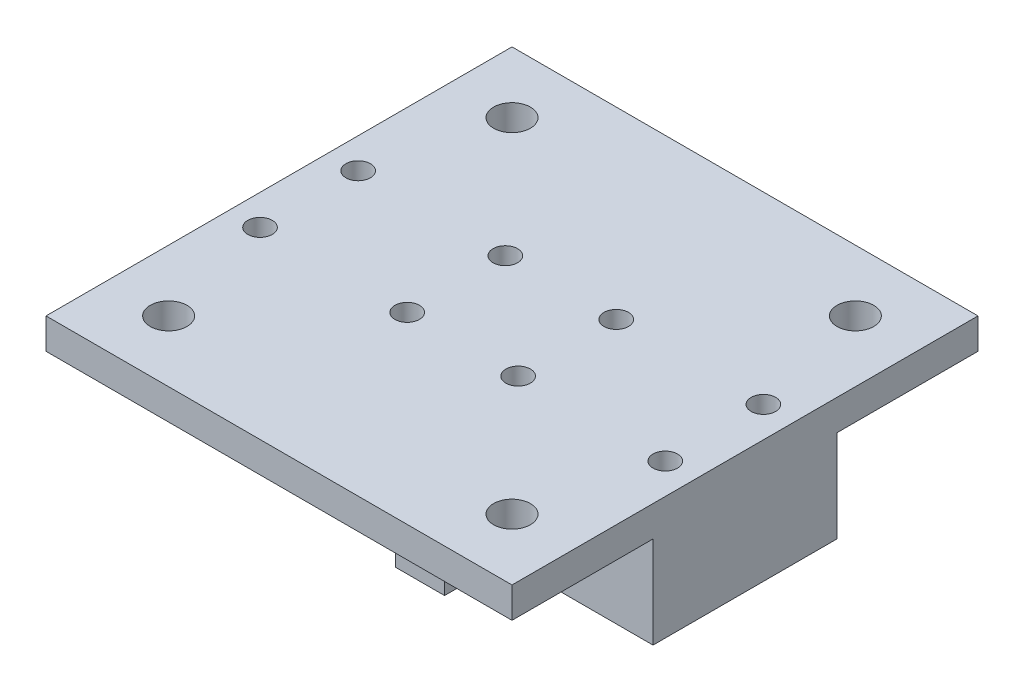
ISO-10303-21;
HEADER;
FILE_DESCRIPTION(('STEP AP214'),'2;1');
FILE_NAME('part.step','',(''),(''),'','','');
FILE_SCHEMA(('AUTOMOTIVE_DESIGN { 1 0 10303 214 1 1 1 1 }'));
ENDSEC;
DATA;
#1=APPLICATION_CONTEXT('core data for automotive mechanical design processes');
#2=APPLICATION_PROTOCOL_DEFINITION('international standard','automotive_design',2000,#1);
#3=PRODUCT_CONTEXT('',#1,'mechanical');
#4=PRODUCT('Part','Part','',(#3));
#5=PRODUCT_RELATED_PRODUCT_CATEGORY('part','',(#4));
#6=PRODUCT_DEFINITION_FORMATION('','',#4);
#7=PRODUCT_DEFINITION_CONTEXT('part definition',#1,'design');
#8=PRODUCT_DEFINITION('design','',#6,#7);
#9=PRODUCT_DEFINITION_SHAPE('','',#8);
#10=(LENGTH_UNIT() NAMED_UNIT(*) SI_UNIT(.MILLI.,.METRE.));
#11=(NAMED_UNIT(*) PLANE_ANGLE_UNIT() SI_UNIT($,.RADIAN.));
#12=(NAMED_UNIT(*) SI_UNIT($,.STERADIAN.) SOLID_ANGLE_UNIT());
#13=UNCERTAINTY_MEASURE_WITH_UNIT(LENGTH_MEASURE(1.E-05),#10,'distance_accuracy_value','');
#14=(GEOMETRIC_REPRESENTATION_CONTEXT(3) GLOBAL_UNCERTAINTY_ASSIGNED_CONTEXT((#13)) GLOBAL_UNIT_ASSIGNED_CONTEXT((#10,
#11,#12)) REPRESENTATION_CONTEXT('',''));
#15=CARTESIAN_POINT('',(0.,0.,0.));
#16=DIRECTION('',(0.,0.,1.));
#17=DIRECTION('',(1.,0.,0.));
#18=AXIS2_PLACEMENT_3D('',#15,#16,#17);
#19=CARTESIAN_POINT('',(4.,-15.,-30.));
#20=DIRECTION('',(0.,-1.,0.));
#21=DIRECTION('',(0.,0.,-1.));
#22=AXIS2_PLACEMENT_3D('',#19,#20,#21);
#23=PLANE('',#22);
#24=DIRECTION('',(1.,0.,0.));
#25=VECTOR('',#24,1.);
#26=CARTESIAN_POINT('',(4.,-15.,-25.));
#27=LINE('',#26,#25);
#28=CARTESIAN_POINT('',(-4.,-15.,-25.));
#29=VERTEX_POINT('',#28);
#30=CARTESIAN_POINT('',(4.,-15.,-25.));
#31=VERTEX_POINT('',#30);
#32=EDGE_CURVE('E198',#29,#31,#27,.T.);
#33=ORIENTED_EDGE('',*,*,#32,.F.);
#34=DIRECTION('',(0.,0.,1.));
#35=VECTOR('',#34,1.);
#36=CARTESIAN_POINT('',(-4.,-15.,-30.));
#37=LINE('',#36,#35);
#38=CARTESIAN_POINT('',(-4.,-15.,-30.));
#39=VERTEX_POINT('',#38);
#40=EDGE_CURVE('E329',#39,#29,#37,.T.);
#41=ORIENTED_EDGE('',*,*,#40,.F.);
#42=DIRECTION('',(1.,0.,0.));
#43=VECTOR('',#42,1.);
#44=CARTESIAN_POINT('',(-4.,-15.,-30.));
#45=LINE('',#44,#43);
#46=CARTESIAN_POINT('',(4.,-15.,-30.));
#47=VERTEX_POINT('',#46);
#48=EDGE_CURVE('E292',#39,#47,#45,.T.);
#49=ORIENTED_EDGE('',*,*,#48,.T.);
#50=DIRECTION('',(0.,0.,1.));
#51=VECTOR('',#50,1.);
#52=CARTESIAN_POINT('',(4.,-15.,-30.));
#53=LINE('',#52,#51);
#54=EDGE_CURVE('E347',#47,#31,#53,.T.);
#55=ORIENTED_EDGE('',*,*,#54,.T.);
#56=EDGE_LOOP('',(#33,#41,#49,#55));
#57=FACE_BOUND('',#56,.T.);
#58=ADVANCED_FACE('F36',(#57),#23,.T.);
#59=CARTESIAN_POINT('',(0.,-10.,-30.));
#60=DIRECTION('',(0.,-1.,0.));
#61=DIRECTION('',(0.,0.,-1.));
#62=AXIS2_PLACEMENT_3D('',#59,#60,#61);
#63=PLANE('',#62);
#64=DIRECTION('',(0.,0.,1.));
#65=VECTOR('',#64,1.);
#66=CARTESIAN_POINT('',(-2.5,-10.,-30.));
#67=LINE('',#66,#65);
#68=CARTESIAN_POINT('',(-2.5,-10.,-30.));
#69=VERTEX_POINT('',#68);
#70=CARTESIAN_POINT('',(-2.5,-10.,-25.));
#71=VERTEX_POINT('',#70);
#72=EDGE_CURVE('E278',#69,#71,#67,.T.);
#73=ORIENTED_EDGE('',*,*,#72,.T.);
#74=DIRECTION('',(1.,0.,0.));
#75=VECTOR('',#74,1.);
#76=CARTESIAN_POINT('',(0.,-10.,-25.));
#77=LINE('',#76,#75);
#78=CARTESIAN_POINT('',(2.5,-10.,-25.));
#79=VERTEX_POINT('',#78);
#80=EDGE_CURVE('E11',#71,#79,#77,.T.);
#81=ORIENTED_EDGE('',*,*,#80,.T.);
#82=DIRECTION('',(0.,0.,1.));
#83=VECTOR('',#82,1.);
#84=CARTESIAN_POINT('',(2.5,-10.,-30.));
#85=LINE('',#84,#83);
#86=CARTESIAN_POINT('',(2.5,-10.,-30.));
#87=VERTEX_POINT('',#86);
#88=EDGE_CURVE('E288',#87,#79,#85,.T.);
#89=ORIENTED_EDGE('',*,*,#88,.F.);
#90=DIRECTION('',(1.,0.,0.));
#91=VECTOR('',#90,1.);
#92=CARTESIAN_POINT('',(0.,-10.,-30.));
#93=LINE('',#92,#91);
#94=EDGE_CURVE('E254',#69,#87,#93,.T.);
#95=ORIENTED_EDGE('',*,*,#94,.F.);
#96=EDGE_LOOP('',(#73,#81,#89,#95));
#97=FACE_BOUND('',#96,.T.);
#98=ADVANCED_FACE('F535',(#97),#63,.F.);
#99=CARTESIAN_POINT('',(0.,0.,0.));
#100=DIRECTION('',(0.,0.,-1.));
#101=DIRECTION('',(-1.,0.,0.));
#102=AXIS2_PLACEMENT_3D('',#99,#100,#101);
#103=PLANE('',#102);
#104=DIRECTION('',(1.,0.,0.));
#105=VECTOR('',#104,1.);
#106=CARTESIAN_POINT('',(0.,-10.,0.));
#107=LINE('',#106,#105);
#108=CARTESIAN_POINT('',(-2.5,-10.,0.));
#109=VERTEX_POINT('',#108);
#110=CARTESIAN_POINT('',(2.5,-10.,0.));
#111=VERTEX_POINT('',#110);
#112=EDGE_CURVE('E253',#109,#111,#107,.T.);
#113=ORIENTED_EDGE('',*,*,#112,.F.);
#114=DIRECTION('',(0.,-1.,0.));
#115=VECTOR('',#114,1.);
#116=CARTESIAN_POINT('',(-2.5,-7.50000000000001,0.));
#117=LINE('',#116,#115);
#118=CARTESIAN_POINT('',(-2.5,-5.,0.));
#119=VERTEX_POINT('',#118);
#120=EDGE_CURVE('E258',#119,#109,#117,.T.);
#121=ORIENTED_EDGE('',*,*,#120,.F.);
#122=DIRECTION('',(-1.,0.,0.));
#123=VECTOR('',#122,1.);
#124=CARTESIAN_POINT('',(-2.5,-5.,0.));
#125=LINE('',#124,#123);
#126=CARTESIAN_POINT('',(2.5,-5.,0.));
#127=VERTEX_POINT('',#126);
#128=EDGE_CURVE('E273',#127,#119,#125,.T.);
#129=ORIENTED_EDGE('',*,*,#128,.F.);
#130=DIRECTION('',(0.,1.,0.));
#131=VECTOR('',#130,1.);
#132=CARTESIAN_POINT('',(2.5,-7.50000000000001,0.));
#133=LINE('',#132,#131);
#134=EDGE_CURVE('E270',#111,#127,#133,.T.);
#135=ORIENTED_EDGE('',*,*,#134,.F.);
#136=EDGE_LOOP('',(#113,#121,#129,#135));
#137=FACE_BOUND('',#136,.T.);
#138=DIRECTION('',(1.,0.,0.));
#139=VECTOR('',#138,1.);
#140=CARTESIAN_POINT('',(-38.,10.,0.));
#141=LINE('',#140,#139);
#142=CARTESIAN_POINT('',(-38.,10.,0.));
#143=VERTEX_POINT('',#142);
#144=CARTESIAN_POINT('',(38.,10.,0.));
#145=VERTEX_POINT('',#144);
#146=EDGE_CURVE('E234',#143,#145,#141,.T.);
#147=ORIENTED_EDGE('',*,*,#146,.F.);
#148=DIRECTION('',(0.,-1.,0.));
#149=VECTOR('',#148,1.);
#150=CARTESIAN_POINT('',(-38.,9.99999999999999,0.));
#151=LINE('',#150,#149);
#152=CARTESIAN_POINT('',(-38.,-5.,0.));
#153=VERTEX_POINT('',#152);
#154=EDGE_CURVE('E322',#143,#153,#151,.T.);
#155=ORIENTED_EDGE('',*,*,#154,.T.);
#156=DIRECTION('',(1.,0.,0.));
#157=VECTOR('',#156,1.);
#158=CARTESIAN_POINT('',(-38.,-5.,0.));
#159=LINE('',#158,#157);
#160=CARTESIAN_POINT('',(-4.,-5.,0.));
#161=VERTEX_POINT('',#160);
#162=EDGE_CURVE('E324',#153,#161,#159,.T.);
#163=ORIENTED_EDGE('',*,*,#162,.T.);
#164=DIRECTION('',(0.,-1.,0.));
#165=VECTOR('',#164,1.);
#166=CARTESIAN_POINT('',(-4.,-5.,0.));
#167=LINE('',#166,#165);
#168=CARTESIAN_POINT('',(-4.,-15.,0.));
#169=VERTEX_POINT('',#168);
#170=EDGE_CURVE('E295',#161,#169,#167,.T.);
#171=ORIENTED_EDGE('',*,*,#170,.T.);
#172=DIRECTION('',(1.,0.,0.));
#173=VECTOR('',#172,1.);
#174=CARTESIAN_POINT('',(4.,-15.,0.));
#175=LINE('',#174,#173);
#176=CARTESIAN_POINT('',(4.,-15.,0.));
#177=VERTEX_POINT('',#176);
#178=EDGE_CURVE('E281',#169,#177,#175,.T.);
#179=ORIENTED_EDGE('',*,*,#178,.T.);
#180=DIRECTION('',(0.,1.,0.));
#181=VECTOR('',#180,1.);
#182=CARTESIAN_POINT('',(4.,-5.,0.));
#183=LINE('',#182,#181);
#184=CARTESIAN_POINT('',(4.,-5.,0.));
#185=VERTEX_POINT('',#184);
#186=EDGE_CURVE('E314',#177,#185,#183,.T.);
#187=ORIENTED_EDGE('',*,*,#186,.T.);
#188=DIRECTION('',(1.,0.,0.));
#189=VECTOR('',#188,1.);
#190=CARTESIAN_POINT('',(4.,-5.,0.));
#191=LINE('',#190,#189);
#192=CARTESIAN_POINT('',(38.,-5.,0.));
#193=VERTEX_POINT('',#192);
#194=EDGE_CURVE('E317',#185,#193,#191,.T.);
#195=ORIENTED_EDGE('',*,*,#194,.T.);
#196=DIRECTION('',(0.,1.,0.));
#197=VECTOR('',#196,1.);
#198=CARTESIAN_POINT('',(38.,9.99999999999999,0.));
#199=LINE('',#198,#197);
#200=EDGE_CURVE('E320',#193,#145,#199,.T.);
#201=ORIENTED_EDGE('',*,*,#200,.T.);
#202=EDGE_LOOP('',(#147,#155,#163,#171,#179,#187,#195,#201));
#203=FACE_BOUND('',#202,.T.);
#204=ADVANCED_FACE('F514',(#137,#203),#103,.F.);
#205=CARTESIAN_POINT('',(-4.,-5.,-30.));
#206=DIRECTION('',(-1.,0.,0.));
#207=DIRECTION('',(0.,0.,1.));
#208=AXIS2_PLACEMENT_3D('',#205,#206,#207);
#209=PLANE('',#208);
#210=DIRECTION('',(0.,-1.,0.));
#211=VECTOR('',#210,1.);
#212=CARTESIAN_POINT('',(-4.,-10.,-25.));
#213=LINE('',#212,#211);
#214=CARTESIAN_POINT('',(-4.,-10.,-25.));
#215=VERTEX_POINT('',#214);
#216=EDGE_CURVE('E208',#215,#29,#213,.T.);
#217=ORIENTED_EDGE('',*,*,#216,.F.);
#218=DIRECTION('',(0.,0.,-1.));
#219=VECTOR('',#218,1.);
#220=CARTESIAN_POINT('',(-4.,-10.,-5.));
#221=LINE('',#220,#219);
#222=CARTESIAN_POINT('',(-4.,-10.,-5.));
#223=VERTEX_POINT('',#222);
#224=EDGE_CURVE('E188',#223,#215,#221,.T.);
#225=ORIENTED_EDGE('',*,*,#224,.F.);
#226=DIRECTION('',(0.,-1.,0.));
#227=VECTOR('',#226,1.);
#228=CARTESIAN_POINT('',(-4.,-10.,-5.));
#229=LINE('',#228,#227);
#230=CARTESIAN_POINT('',(-4.,-15.,-5.));
#231=VERTEX_POINT('',#230);
#232=EDGE_CURVE('E204',#223,#231,#229,.T.);
#233=ORIENTED_EDGE('',*,*,#232,.T.);
#234=EDGE_CURVE('E332',#231,#169,#37,.T.);
#235=ORIENTED_EDGE('',*,*,#234,.T.);
#236=ORIENTED_EDGE('',*,*,#170,.F.);
#237=DIRECTION('',(0.,0.,1.));
#238=VECTOR('',#237,1.);
#239=CARTESIAN_POINT('',(-4.,-5.,-30.));
#240=LINE('',#239,#238);
#241=CARTESIAN_POINT('',(-4.,-5.,-30.));
#242=VERTEX_POINT('',#241);
#243=EDGE_CURVE('E333',#242,#161,#240,.T.);
#244=ORIENTED_EDGE('',*,*,#243,.F.);
#245=DIRECTION('',(0.,-1.,0.));
#246=VECTOR('',#245,1.);
#247=CARTESIAN_POINT('',(-4.,-5.,-30.));
#248=LINE('',#247,#246);
#249=EDGE_CURVE('E309',#242,#39,#248,.T.);
#250=ORIENTED_EDGE('',*,*,#249,.T.);
#251=ORIENTED_EDGE('',*,*,#40,.T.);
#252=EDGE_LOOP('',(#217,#225,#233,#235,#236,#244,#250,#251));
#253=FACE_BOUND('',#252,.T.);
#254=ADVANCED_FACE('F367',(#253),#209,.T.);
#255=CARTESIAN_POINT('',(-38.,-5.,-30.));
#256=DIRECTION('',(0.,-1.,0.));
#257=DIRECTION('',(0.,0.,-1.));
#258=AXIS2_PLACEMENT_3D('',#255,#256,#257);
#259=PLANE('',#258);
#260=CARTESIAN_POINT('',(-9.04824963488739,-5.,-22.9546021896256));
#261=DIRECTION('',(0.,-1.,0.));
#262=DIRECTION('',(0.,0.,-1.));
#263=AXIS2_PLACEMENT_3D('',#260,#261,#262);
#264=CIRCLE('',#263,2.);
#265=CARTESIAN_POINT('',(-9.04824963488739,-5.,-24.9546021896256));
#266=VERTEX_POINT('',#265);
#267=EDGE_CURVE('E400',#266,#266,#264,.T.);
#268=ORIENTED_EDGE('',*,*,#267,.F.);
#269=EDGE_LOOP('',(#268));
#270=FACE_BOUND('',#269,.T.);
#271=CARTESIAN_POINT('',(-33.0482496348874,-5.,-22.9546021896256));
#272=DIRECTION('',(0.,-1.,0.));
#273=DIRECTION('',(0.,0.,-1.));
#274=AXIS2_PLACEMENT_3D('',#271,#272,#273);
#275=CIRCLE('',#274,2.);
#276=CARTESIAN_POINT('',(-33.0482496348874,-5.,-24.9546021896256));
#277=VERTEX_POINT('',#276);
#278=EDGE_CURVE('E381',#277,#277,#275,.T.);
#279=ORIENTED_EDGE('',*,*,#278,.F.);
#280=EDGE_LOOP('',(#279));
#281=FACE_BOUND('',#280,.T.);
#282=CARTESIAN_POINT('',(-9.04824963488739,-5.,-6.95460218962563));
#283=DIRECTION('',(0.,-1.,0.));
#284=DIRECTION('',(0.,0.,-1.));
#285=AXIS2_PLACEMENT_3D('',#282,#283,#284);
#286=CIRCLE('',#285,2.);
#287=CARTESIAN_POINT('',(-9.04824963488739,-5.,-8.95460218962563));
#288=VERTEX_POINT('',#287);
#289=EDGE_CURVE('E388',#288,#288,#286,.T.);
#290=ORIENTED_EDGE('',*,*,#289,.F.);
#291=EDGE_LOOP('',(#290));
#292=FACE_BOUND('',#291,.T.);
#293=CARTESIAN_POINT('',(-33.0482496348874,-5.,-6.95460218962563));
#294=DIRECTION('',(0.,-1.,0.));
#295=DIRECTION('',(0.,0.,-1.));
#296=AXIS2_PLACEMENT_3D('',#293,#294,#295);
#297=CIRCLE('',#296,2.);
#298=CARTESIAN_POINT('',(-33.0482496348874,-5.,-8.95460218962563));
#299=VERTEX_POINT('',#298);
#300=EDGE_CURVE('E375',#299,#299,#297,.T.);
#301=ORIENTED_EDGE('',*,*,#300,.F.);
#302=EDGE_LOOP('',(#301));
#303=FACE_BOUND('',#302,.T.);
#304=ORIENTED_EDGE('',*,*,#162,.F.);
#305=DIRECTION('',(0.,0.,1.));
#306=VECTOR('',#305,1.);
#307=CARTESIAN_POINT('',(-38.,-5.,-30.));
#308=LINE('',#307,#306);
#309=CARTESIAN_POINT('',(-38.,-5.,-30.));
#310=VERTEX_POINT('',#309);
#311=EDGE_CURVE('E335',#310,#153,#308,.T.);
#312=ORIENTED_EDGE('',*,*,#311,.F.);
#313=DIRECTION('',(1.,0.,0.));
#314=VECTOR('',#313,1.);
#315=CARTESIAN_POINT('',(-38.,-5.,-30.));
#316=LINE('',#315,#314);
#317=EDGE_CURVE('E306',#310,#242,#316,.T.);
#318=ORIENTED_EDGE('',*,*,#317,.T.);
#319=ORIENTED_EDGE('',*,*,#243,.T.);
#320=EDGE_LOOP('',(#304,#312,#318,#319));
#321=FACE_BOUND('',#320,.T.);
#322=ADVANCED_FACE('F524',(#270,#281,#292,#303,#321),#259,.T.);
#323=CARTESIAN_POINT('',(-38.,9.99999999999999,-30.));
#324=DIRECTION('',(-1.,0.,0.));
#325=DIRECTION('',(0.,0.,1.));
#326=AXIS2_PLACEMENT_3D('',#323,#324,#325);
#327=PLANE('',#326);
#328=ORIENTED_EDGE('',*,*,#154,.F.);
#329=DIRECTION('',(0.,0.,-1.));
#330=VECTOR('',#329,1.);
#331=CARTESIAN_POINT('',(-38.,10.,23.));
#332=LINE('',#331,#330);
#333=CARTESIAN_POINT('',(-38.,10.,23.));
#334=VERTEX_POINT('',#333);
#335=EDGE_CURVE('E250',#334,#143,#332,.T.);
#336=ORIENTED_EDGE('',*,*,#335,.F.);
#337=DIRECTION('',(0.,-1.,0.));
#338=VECTOR('',#337,1.);
#339=CARTESIAN_POINT('',(-38.,15.,23.));
#340=LINE('',#339,#338);
#341=CARTESIAN_POINT('',(-38.,15.,23.));
#342=VERTEX_POINT('',#341);
#343=EDGE_CURVE('E238',#342,#334,#340,.T.);
#344=ORIENTED_EDGE('',*,*,#343,.F.);
#345=DIRECTION('',(0.,0.,1.));
#346=VECTOR('',#345,1.);
#347=CARTESIAN_POINT('',(-38.,15.,-30.));
#348=LINE('',#347,#346);
#349=CARTESIAN_POINT('',(-38.,15.,-53.));
#350=VERTEX_POINT('',#349);
#351=EDGE_CURVE('E338',#350,#342,#348,.T.);
#352=ORIENTED_EDGE('',*,*,#351,.F.);
#353=DIRECTION('',(0.,1.,0.));
#354=VECTOR('',#353,1.);
#355=CARTESIAN_POINT('',(-38.,10.,-53.));
#356=LINE('',#355,#354);
#357=CARTESIAN_POINT('',(-38.,10.,-53.));
#358=VERTEX_POINT('',#357);
#359=EDGE_CURVE('E222',#358,#350,#356,.T.);
#360=ORIENTED_EDGE('',*,*,#359,.F.);
#361=DIRECTION('',(0.,0.,1.));
#362=VECTOR('',#361,1.);
#363=CARTESIAN_POINT('',(-38.,10.,-53.));
#364=LINE('',#363,#362);
#365=CARTESIAN_POINT('',(-38.,10.,-30.));
#366=VERTEX_POINT('',#365);
#367=EDGE_CURVE('E225',#358,#366,#364,.T.);
#368=ORIENTED_EDGE('',*,*,#367,.T.);
#369=DIRECTION('',(0.,-1.,0.));
#370=VECTOR('',#369,1.);
#371=CARTESIAN_POINT('',(-38.,15.,-30.));
#372=LINE('',#371,#370);
#373=EDGE_CURVE('E304',#366,#310,#372,.T.);
#374=ORIENTED_EDGE('',*,*,#373,.T.);
#375=ORIENTED_EDGE('',*,*,#311,.T.);
#376=EDGE_LOOP('',(#328,#336,#344,#352,#360,#368,#374,#375));
#377=FACE_BOUND('',#376,.T.);
#378=ADVANCED_FACE('F461',(#377),#327,.T.);
#379=CARTESIAN_POINT('',(0.,15.,-30.));
#380=DIRECTION('',(0.,1.,0.));
#381=DIRECTION('',(0.,0.,1.));
#382=AXIS2_PLACEMENT_3D('',#379,#380,#381);
#383=PLANE('',#382);
#384=CARTESIAN_POINT('',(28.,15.,-42.9999999999998));
#385=DIRECTION('',(0.,1.,0.));
#386=DIRECTION('',(0.,0.,1.));
#387=AXIS2_PLACEMENT_3D('',#384,#385,#386);
#388=CIRCLE('',#387,3.);
#389=CARTESIAN_POINT('',(28.,15.,-39.9999999999998));
#390=VERTEX_POINT('',#389);
#391=EDGE_CURVE('E429',#390,#390,#388,.T.);
#392=ORIENTED_EDGE('',*,*,#391,.F.);
#393=EDGE_LOOP('',(#392));
#394=FACE_BOUND('',#393,.T.);
#395=CARTESIAN_POINT('',(-28.,15.,-43.));
#396=DIRECTION('',(0.,1.,0.));
#397=DIRECTION('',(0.,0.,1.));
#398=AXIS2_PLACEMENT_3D('',#395,#396,#397);
#399=CIRCLE('',#398,3.);
#400=CARTESIAN_POINT('',(-28.,15.,-40.));
#401=VERTEX_POINT('',#400);
#402=EDGE_CURVE('E435',#401,#401,#399,.T.);
#403=ORIENTED_EDGE('',*,*,#402,.F.);
#404=EDGE_LOOP('',(#403));
#405=FACE_BOUND('',#404,.T.);
#406=CARTESIAN_POINT('',(-28.,15.,13.));
#407=DIRECTION('',(0.,1.,0.));
#408=DIRECTION('',(0.,0.,1.));
#409=AXIS2_PLACEMENT_3D('',#406,#407,#408);
#410=CIRCLE('',#409,3.);
#411=CARTESIAN_POINT('',(-28.,15.,16.));
#412=VERTEX_POINT('',#411);
#413=EDGE_CURVE('E441',#412,#412,#410,.T.);
#414=ORIENTED_EDGE('',*,*,#413,.F.);
#415=EDGE_LOOP('',(#414));
#416=FACE_BOUND('',#415,.T.);
#417=CARTESIAN_POINT('',(28.,15.,13.0000000000001));
#418=DIRECTION('',(0.,1.,0.));
#419=DIRECTION('',(0.,0.,1.));
#420=AXIS2_PLACEMENT_3D('',#417,#418,#419);
#421=CIRCLE('',#420,3.);
#422=CARTESIAN_POINT('',(28.,15.,16.0000000000001));
#423=VERTEX_POINT('',#422);
#424=EDGE_CURVE('E423',#423,#423,#421,.T.);
#425=ORIENTED_EDGE('',*,*,#424,.F.);
#426=EDGE_LOOP('',(#425));
#427=FACE_BOUND('',#426,.T.);
#428=CARTESIAN_POINT('',(9.,15.,-7.));
#429=DIRECTION('',(0.,-1.,0.));
#430=DIRECTION('',(0.,0.,-1.));
#431=AXIS2_PLACEMENT_3D('',#428,#429,#430);
#432=CIRCLE('',#431,2.);
#433=CARTESIAN_POINT('',(9.,15.,-9.));
#434=VERTEX_POINT('',#433);
#435=EDGE_CURVE('E396',#434,#434,#432,.T.);
#436=ORIENTED_EDGE('',*,*,#435,.T.);
#437=EDGE_LOOP('',(#436));
#438=FACE_BOUND('',#437,.T.);
#439=CARTESIAN_POINT('',(-9.04824963488739,15.,-22.9546021896256));
#440=DIRECTION('',(0.,-1.,0.));
#441=DIRECTION('',(0.,0.,-1.));
#442=AXIS2_PLACEMENT_3D('',#439,#440,#441);
#443=CIRCLE('',#442,2.);
#444=CARTESIAN_POINT('',(-9.04824963488739,15.,-24.9546021896256));
#445=VERTEX_POINT('',#444);
#446=EDGE_CURVE('E385',#445,#445,#443,.T.);
#447=ORIENTED_EDGE('',*,*,#446,.T.);
#448=EDGE_LOOP('',(#447));
#449=FACE_BOUND('',#448,.T.);
#450=CARTESIAN_POINT('',(-33.0482496348874,15.,-22.9546021896256));
#451=DIRECTION('',(0.,-1.,0.));
#452=DIRECTION('',(0.,0.,-1.));
#453=AXIS2_PLACEMENT_3D('',#450,#451,#452);
#454=CIRCLE('',#453,2.);
#455=CARTESIAN_POINT('',(-33.0482496348874,15.,-24.9546021896256));
#456=VERTEX_POINT('',#455);
#457=EDGE_CURVE('E384',#456,#456,#454,.T.);
#458=ORIENTED_EDGE('',*,*,#457,.T.);
#459=EDGE_LOOP('',(#458));
#460=FACE_BOUND('',#459,.T.);
#461=CARTESIAN_POINT('',(-9.04824963488739,15.,-6.95460218962563));
#462=DIRECTION('',(0.,-1.,0.));
#463=DIRECTION('',(0.,0.,-1.));
#464=AXIS2_PLACEMENT_3D('',#461,#462,#463);
#465=CIRCLE('',#464,2.);
#466=CARTESIAN_POINT('',(-9.04824963488739,15.,-8.95460218962563));
#467=VERTEX_POINT('',#466);
#468=EDGE_CURVE('E378',#467,#467,#465,.T.);
#469=ORIENTED_EDGE('',*,*,#468,.T.);
#470=EDGE_LOOP('',(#469));
#471=FACE_BOUND('',#470,.T.);
#472=CARTESIAN_POINT('',(33.,15.,-7.));
#473=DIRECTION('',(0.,-1.,0.));
#474=DIRECTION('',(0.,0.,-1.));
#475=AXIS2_PLACEMENT_3D('',#472,#473,#474);
#476=CIRCLE('',#475,2.);
#477=CARTESIAN_POINT('',(33.,15.,-9.));
#478=VERTEX_POINT('',#477);
#479=EDGE_CURVE('E397',#478,#478,#476,.T.);
#480=ORIENTED_EDGE('',*,*,#479,.T.);
#481=EDGE_LOOP('',(#480));
#482=FACE_BOUND('',#481,.T.);
#483=CARTESIAN_POINT('',(33.,15.,-23.));
#484=DIRECTION('',(0.,-1.,0.));
#485=DIRECTION('',(0.,0.,-1.));
#486=AXIS2_PLACEMENT_3D('',#483,#484,#485);
#487=CIRCLE('',#486,2.);
#488=CARTESIAN_POINT('',(33.,15.,-25.));
#489=VERTEX_POINT('',#488);
#490=EDGE_CURVE('E415',#489,#489,#487,.T.);
#491=ORIENTED_EDGE('',*,*,#490,.T.);
#492=EDGE_LOOP('',(#491));
#493=FACE_BOUND('',#492,.T.);
#494=CARTESIAN_POINT('',(9.,15.,-23.));
#495=DIRECTION('',(0.,-1.,0.));
#496=DIRECTION('',(0.,0.,-1.));
#497=AXIS2_PLACEMENT_3D('',#494,#495,#496);
#498=CIRCLE('',#497,2.);
#499=CARTESIAN_POINT('',(9.,15.,-25.));
#500=VERTEX_POINT('',#499);
#501=EDGE_CURVE('E408',#500,#500,#498,.T.);
#502=ORIENTED_EDGE('',*,*,#501,.T.);
#503=EDGE_LOOP('',(#502));
#504=FACE_BOUND('',#503,.T.);
#505=CARTESIAN_POINT('',(-33.0482496348874,15.,-6.95460218962563));
#506=DIRECTION('',(0.,-1.,0.));
#507=DIRECTION('',(0.,0.,-1.));
#508=AXIS2_PLACEMENT_3D('',#505,#506,#507);
#509=CIRCLE('',#508,2.);
#510=CARTESIAN_POINT('',(-33.0482496348874,15.,-8.95460218962563));
#511=VERTEX_POINT('',#510);
#512=EDGE_CURVE('E372',#511,#511,#509,.T.);
#513=ORIENTED_EDGE('',*,*,#512,.T.);
#514=EDGE_LOOP('',(#513));
#515=FACE_BOUND('',#514,.T.);
#516=ORIENTED_EDGE('',*,*,#351,.T.);
#517=DIRECTION('',(-1.,0.,0.));
#518=VECTOR('',#517,1.);
#519=CARTESIAN_POINT('',(38.,15.,23.));
#520=LINE('',#519,#518);
#521=CARTESIAN_POINT('',(38.,15.,23.));
#522=VERTEX_POINT('',#521);
#523=EDGE_CURVE('E235',#522,#342,#520,.T.);
#524=ORIENTED_EDGE('',*,*,#523,.F.);
#525=DIRECTION('',(0.,0.,1.));
#526=VECTOR('',#525,1.);
#527=CARTESIAN_POINT('',(38.,15.,-30.));
#528=LINE('',#527,#526);
#529=CARTESIAN_POINT('',(38.,15.,-53.));
#530=VERTEX_POINT('',#529);
#531=EDGE_CURVE('E340',#530,#522,#528,.T.);
#532=ORIENTED_EDGE('',*,*,#531,.F.);
#533=DIRECTION('',(1.,0.,0.));
#534=VECTOR('',#533,1.);
#535=CARTESIAN_POINT('',(-38.,15.,-53.));
#536=LINE('',#535,#534);
#537=EDGE_CURVE('E214',#350,#530,#536,.T.);
#538=ORIENTED_EDGE('',*,*,#537,.F.);
#539=EDGE_LOOP('',(#516,#524,#532,#538));
#540=FACE_BOUND('',#539,.T.);
#541=ADVANCED_FACE('F457',(#394,#405,#416,#427,#438,#449,#460,#471,#482,#493,#504,#515,#540),
#383,.T.);
#542=CARTESIAN_POINT('',(38.,9.99999999999999,-30.));
#543=DIRECTION('',(1.,0.,0.));
#544=DIRECTION('',(0.,0.,-1.));
#545=AXIS2_PLACEMENT_3D('',#542,#543,#544);
#546=PLANE('',#545);
#547=ORIENTED_EDGE('',*,*,#200,.F.);
#548=DIRECTION('',(0.,0.,1.));
#549=VECTOR('',#548,1.);
#550=CARTESIAN_POINT('',(38.,-5.,-30.));
#551=LINE('',#550,#549);
#552=CARTESIAN_POINT('',(38.,-5.,-30.));
#553=VERTEX_POINT('',#552);
#554=EDGE_CURVE('E342',#553,#193,#551,.T.);
#555=ORIENTED_EDGE('',*,*,#554,.F.);
#556=DIRECTION('',(0.,1.,0.));
#557=VECTOR('',#556,1.);
#558=CARTESIAN_POINT('',(38.,9.99999999999999,-30.));
#559=LINE('',#558,#557);
#560=CARTESIAN_POINT('',(38.,10.,-30.));
#561=VERTEX_POINT('',#560);
#562=EDGE_CURVE('E301',#553,#561,#559,.T.);
#563=ORIENTED_EDGE('',*,*,#562,.T.);
#564=DIRECTION('',(0.,0.,1.));
#565=VECTOR('',#564,1.);
#566=CARTESIAN_POINT('',(38.,10.,-53.));
#567=LINE('',#566,#565);
#568=CARTESIAN_POINT('',(38.,10.,-53.));
#569=VERTEX_POINT('',#568);
#570=EDGE_CURVE('E231',#569,#561,#567,.T.);
#571=ORIENTED_EDGE('',*,*,#570,.F.);
#572=DIRECTION('',(0.,-1.,0.));
#573=VECTOR('',#572,1.);
#574=CARTESIAN_POINT('',(38.,15.,-53.));
#575=LINE('',#574,#573);
#576=EDGE_CURVE('E217',#530,#569,#575,.T.);
#577=ORIENTED_EDGE('',*,*,#576,.F.);
#578=ORIENTED_EDGE('',*,*,#531,.T.);
#579=DIRECTION('',(0.,1.,0.));
#580=VECTOR('',#579,1.);
#581=CARTESIAN_POINT('',(38.,10.,23.));
#582=LINE('',#581,#580);
#583=CARTESIAN_POINT('',(38.,10.,23.));
#584=VERTEX_POINT('',#583);
#585=EDGE_CURVE('E242',#584,#522,#582,.T.);
#586=ORIENTED_EDGE('',*,*,#585,.F.);
#587=DIRECTION('',(0.,0.,-1.));
#588=VECTOR('',#587,1.);
#589=CARTESIAN_POINT('',(38.,10.,23.));
#590=LINE('',#589,#588);
#591=EDGE_CURVE('E245',#584,#145,#590,.T.);
#592=ORIENTED_EDGE('',*,*,#591,.T.);
#593=EDGE_LOOP('',(#547,#555,#563,#571,#577,#578,#586,#592));
#594=FACE_BOUND('',#593,.T.);
#595=ADVANCED_FACE('F460',(#594),#546,.T.);
#596=CARTESIAN_POINT('',(4.,-5.,-30.));
#597=DIRECTION('',(0.,-1.,0.));
#598=DIRECTION('',(0.,0.,-1.));
#599=AXIS2_PLACEMENT_3D('',#596,#597,#598);
#600=PLANE('',#599);
#601=CARTESIAN_POINT('',(9.,-5.,-7.));
#602=DIRECTION('',(0.,-1.,0.));
#603=DIRECTION('',(0.,0.,-1.));
#604=AXIS2_PLACEMENT_3D('',#601,#602,#603);
#605=CIRCLE('',#604,2.);
#606=CARTESIAN_POINT('',(9.,-5.,-9.));
#607=VERTEX_POINT('',#606);
#608=EDGE_CURVE('E393',#607,#607,#605,.T.);
#609=ORIENTED_EDGE('',*,*,#608,.F.);
#610=EDGE_LOOP('',(#609));
#611=FACE_BOUND('',#610,.T.);
#612=CARTESIAN_POINT('',(33.,-5.,-7.));
#613=DIRECTION('',(0.,-1.,0.));
#614=DIRECTION('',(0.,0.,-1.));
#615=AXIS2_PLACEMENT_3D('',#612,#613,#614);
#616=CIRCLE('',#615,2.);
#617=CARTESIAN_POINT('',(33.,-5.,-9.));
#618=VERTEX_POINT('',#617);
#619=EDGE_CURVE('E418',#618,#618,#616,.T.);
#620=ORIENTED_EDGE('',*,*,#619,.F.);
#621=EDGE_LOOP('',(#620));
#622=FACE_BOUND('',#621,.T.);
#623=CARTESIAN_POINT('',(33.,-5.,-23.));
#624=DIRECTION('',(0.,-1.,0.));
#625=DIRECTION('',(0.,0.,-1.));
#626=AXIS2_PLACEMENT_3D('',#623,#624,#625);
#627=CIRCLE('',#626,2.);
#628=CARTESIAN_POINT('',(33.,-5.,-25.));
#629=VERTEX_POINT('',#628);
#630=EDGE_CURVE('E412',#629,#629,#627,.T.);
#631=ORIENTED_EDGE('',*,*,#630,.F.);
#632=EDGE_LOOP('',(#631));
#633=FACE_BOUND('',#632,.T.);
#634=CARTESIAN_POINT('',(9.,-5.,-23.));
#635=DIRECTION('',(0.,-1.,0.));
#636=DIRECTION('',(0.,0.,-1.));
#637=AXIS2_PLACEMENT_3D('',#634,#635,#636);
#638=CIRCLE('',#637,2.);
#639=CARTESIAN_POINT('',(9.,-5.,-25.));
#640=VERTEX_POINT('',#639);
#641=EDGE_CURVE('E405',#640,#640,#638,.T.);
#642=ORIENTED_EDGE('',*,*,#641,.F.);
#643=EDGE_LOOP('',(#642));
#644=FACE_BOUND('',#643,.T.);
#645=ORIENTED_EDGE('',*,*,#194,.F.);
#646=DIRECTION('',(0.,0.,1.));
#647=VECTOR('',#646,1.);
#648=CARTESIAN_POINT('',(4.,-5.,-30.));
#649=LINE('',#648,#647);
#650=CARTESIAN_POINT('',(4.,-5.,-30.));
#651=VERTEX_POINT('',#650);
#652=EDGE_CURVE('E345',#651,#185,#649,.T.);
#653=ORIENTED_EDGE('',*,*,#652,.F.);
#654=DIRECTION('',(1.,0.,0.));
#655=VECTOR('',#654,1.);
#656=CARTESIAN_POINT('',(4.,-5.,-30.));
#657=LINE('',#656,#655);
#658=EDGE_CURVE('E298',#651,#553,#657,.T.);
#659=ORIENTED_EDGE('',*,*,#658,.T.);
#660=ORIENTED_EDGE('',*,*,#554,.T.);
#661=EDGE_LOOP('',(#645,#653,#659,#660));
#662=FACE_BOUND('',#661,.T.);
#663=ADVANCED_FACE('F512',(#611,#622,#633,#644,#662),#600,.T.);
#664=CARTESIAN_POINT('',(4.,-5.,-30.));
#665=DIRECTION('',(1.,0.,0.));
#666=DIRECTION('',(0.,0.,-1.));
#667=AXIS2_PLACEMENT_3D('',#664,#665,#666);
#668=PLANE('',#667);
#669=DIRECTION('',(0.,-1.,0.));
#670=VECTOR('',#669,1.);
#671=CARTESIAN_POINT('',(4.,-10.,-25.));
#672=LINE('',#671,#670);
#673=CARTESIAN_POINT('',(4.,-10.,-25.));
#674=VERTEX_POINT('',#673);
#675=EDGE_CURVE('E228',#674,#31,#672,.T.);
#676=ORIENTED_EDGE('',*,*,#675,.T.);
#677=ORIENTED_EDGE('',*,*,#54,.F.);
#678=DIRECTION('',(0.,1.,0.));
#679=VECTOR('',#678,1.);
#680=CARTESIAN_POINT('',(4.,-5.,-30.));
#681=LINE('',#680,#679);
#682=EDGE_CURVE('E294',#47,#651,#681,.T.);
#683=ORIENTED_EDGE('',*,*,#682,.T.);
#684=ORIENTED_EDGE('',*,*,#652,.T.);
#685=ORIENTED_EDGE('',*,*,#186,.F.);
#686=CARTESIAN_POINT('',(4.,-15.,-5.));
#687=VERTEX_POINT('',#686);
#688=EDGE_CURVE('E203',#687,#177,#53,.T.);
#689=ORIENTED_EDGE('',*,*,#688,.F.);
#690=DIRECTION('',(0.,-1.,0.));
#691=VECTOR('',#690,1.);
#692=CARTESIAN_POINT('',(4.,-10.,-5.));
#693=LINE('',#692,#691);
#694=CARTESIAN_POINT('',(4.,-10.,-5.));
#695=VERTEX_POINT('',#694);
#696=EDGE_CURVE('E51',#695,#687,#693,.T.);
#697=ORIENTED_EDGE('',*,*,#696,.F.);
#698=DIRECTION('',(0.,0.,1.));
#699=VECTOR('',#698,1.);
#700=CARTESIAN_POINT('',(4.,-10.,-5.));
#701=LINE('',#700,#699);
#702=EDGE_CURVE('E191',#674,#695,#701,.T.);
#703=ORIENTED_EDGE('',*,*,#702,.F.);
#704=EDGE_LOOP('',(#676,#677,#683,#684,#685,#689,#697,#703));
#705=FACE_BOUND('',#704,.T.);
#706=ADVANCED_FACE('F201',(#705),#668,.T.);
#707=DIRECTION('',(-1.,0.,0.));
#708=VECTOR('',#707,1.);
#709=CARTESIAN_POINT('',(4.,-15.,-5.));
#710=LINE('',#709,#708);
#711=EDGE_CURVE('E371',#687,#231,#710,.T.);
#712=ORIENTED_EDGE('',*,*,#711,.F.);
#713=ORIENTED_EDGE('',*,*,#688,.T.);
#714=ORIENTED_EDGE('',*,*,#178,.F.);
#715=ORIENTED_EDGE('',*,*,#234,.F.);
#716=EDGE_LOOP('',(#712,#713,#714,#715));
#717=FACE_BOUND('',#716,.T.);
#718=ADVANCED_FACE('F38',(#717),#23,.T.);
#719=CARTESIAN_POINT('',(0.,0.,-30.));
#720=DIRECTION('',(0.,0.,-1.));
#721=DIRECTION('',(-1.,0.,0.));
#722=AXIS2_PLACEMENT_3D('',#719,#720,#721);
#723=PLANE('',#722);
#724=DIRECTION('',(-1.,0.,0.));
#725=VECTOR('',#724,1.);
#726=CARTESIAN_POINT('',(38.,10.,-30.));
#727=LINE('',#726,#725);
#728=EDGE_CURVE('E218',#561,#366,#727,.T.);
#729=ORIENTED_EDGE('',*,*,#728,.F.);
#730=ORIENTED_EDGE('',*,*,#562,.F.);
#731=ORIENTED_EDGE('',*,*,#658,.F.);
#732=ORIENTED_EDGE('',*,*,#682,.F.);
#733=ORIENTED_EDGE('',*,*,#48,.F.);
#734=ORIENTED_EDGE('',*,*,#249,.F.);
#735=ORIENTED_EDGE('',*,*,#317,.F.);
#736=ORIENTED_EDGE('',*,*,#373,.F.);
#737=EDGE_LOOP('',(#729,#730,#731,#732,#733,#734,#735,#736));
#738=FACE_BOUND('',#737,.T.);
#739=DIRECTION('',(0.,-1.,0.));
#740=VECTOR('',#739,1.);
#741=CARTESIAN_POINT('',(-2.5,-7.50000000000001,-30.));
#742=LINE('',#741,#740);
#743=CARTESIAN_POINT('',(-2.5,-5.,-30.));
#744=VERTEX_POINT('',#743);
#745=EDGE_CURVE('E264',#744,#69,#742,.T.);
#746=ORIENTED_EDGE('',*,*,#745,.T.);
#747=ORIENTED_EDGE('',*,*,#94,.T.);
#748=DIRECTION('',(0.,1.,0.));
#749=VECTOR('',#748,1.);
#750=CARTESIAN_POINT('',(2.5,-7.50000000000001,-30.));
#751=LINE('',#750,#749);
#752=CARTESIAN_POINT('',(2.5,-5.,-30.));
#753=VERTEX_POINT('',#752);
#754=EDGE_CURVE('E257',#87,#753,#751,.T.);
#755=ORIENTED_EDGE('',*,*,#754,.T.);
#756=DIRECTION('',(-1.,0.,0.));
#757=VECTOR('',#756,1.);
#758=CARTESIAN_POINT('',(-2.5,-5.,-30.));
#759=LINE('',#758,#757);
#760=EDGE_CURVE('E261',#753,#744,#759,.T.);
#761=ORIENTED_EDGE('',*,*,#760,.T.);
#762=EDGE_LOOP('',(#746,#747,#755,#761));
#763=FACE_BOUND('',#762,.T.);
#764=ADVANCED_FACE('F506',(#738,#763),#723,.T.);
#765=CARTESIAN_POINT('',(-2.5,-7.50000000000001,-30.));
#766=DIRECTION('',(-1.,0.,0.));
#767=DIRECTION('',(0.,0.,1.));
#768=AXIS2_PLACEMENT_3D('',#765,#766,#767);
#769=PLANE('',#768);
#770=ORIENTED_EDGE('',*,*,#120,.T.);
#771=CARTESIAN_POINT('',(-2.5,-10.,-5.));
#772=VERTEX_POINT('',#771);
#773=EDGE_CURVE('E283',#772,#109,#67,.T.);
#774=ORIENTED_EDGE('',*,*,#773,.F.);
#775=EDGE_CURVE('E282',#71,#772,#67,.T.);
#776=ORIENTED_EDGE('',*,*,#775,.F.);
#777=ORIENTED_EDGE('',*,*,#72,.F.);
#778=ORIENTED_EDGE('',*,*,#745,.F.);
#779=DIRECTION('',(0.,0.,1.));
#780=VECTOR('',#779,1.);
#781=CARTESIAN_POINT('',(-2.5,-5.,-30.));
#782=LINE('',#781,#780);
#783=EDGE_CURVE('E284',#744,#119,#782,.T.);
#784=ORIENTED_EDGE('',*,*,#783,.T.);
#785=EDGE_LOOP('',(#770,#774,#776,#777,#778,#784));
#786=FACE_BOUND('',#785,.T.);
#787=ADVANCED_FACE('F355',(#786),#769,.F.);
#788=CARTESIAN_POINT('',(-2.5,-5.,-30.));
#789=DIRECTION('',(0.,1.,0.));
#790=DIRECTION('',(0.,0.,1.));
#791=AXIS2_PLACEMENT_3D('',#788,#789,#790);
#792=PLANE('',#791);
#793=ORIENTED_EDGE('',*,*,#128,.T.);
#794=ORIENTED_EDGE('',*,*,#783,.F.);
#795=ORIENTED_EDGE('',*,*,#760,.F.);
#796=DIRECTION('',(0.,0.,1.));
#797=VECTOR('',#796,1.);
#798=CARTESIAN_POINT('',(2.5,-5.,-30.));
#799=LINE('',#798,#797);
#800=EDGE_CURVE('E286',#753,#127,#799,.T.);
#801=ORIENTED_EDGE('',*,*,#800,.T.);
#802=EDGE_LOOP('',(#793,#794,#795,#801));
#803=FACE_BOUND('',#802,.T.);
#804=ADVANCED_FACE('F570',(#803),#792,.F.);
#805=CARTESIAN_POINT('',(2.5,-7.50000000000001,-30.));
#806=DIRECTION('',(1.,0.,0.));
#807=DIRECTION('',(0.,0.,-1.));
#808=AXIS2_PLACEMENT_3D('',#805,#806,#807);
#809=PLANE('',#808);
#810=ORIENTED_EDGE('',*,*,#134,.T.);
#811=ORIENTED_EDGE('',*,*,#800,.F.);
#812=ORIENTED_EDGE('',*,*,#754,.F.);
#813=ORIENTED_EDGE('',*,*,#88,.T.);
#814=CARTESIAN_POINT('',(2.5,-10.,-5.));
#815=VERTEX_POINT('',#814);
#816=EDGE_CURVE('E291',#79,#815,#85,.T.);
#817=ORIENTED_EDGE('',*,*,#816,.T.);
#818=EDGE_CURVE('E267',#815,#111,#85,.T.);
#819=ORIENTED_EDGE('',*,*,#818,.T.);
#820=EDGE_LOOP('',(#810,#811,#812,#813,#817,#819));
#821=FACE_BOUND('',#820,.T.);
#822=ADVANCED_FACE('F533',(#821),#809,.F.);
#823=ORIENTED_EDGE('',*,*,#818,.F.);
#824=DIRECTION('',(-1.,0.,0.));
#825=VECTOR('',#824,1.);
#826=CARTESIAN_POINT('',(0.,-10.,-5.));
#827=LINE('',#826,#825);
#828=EDGE_CURVE('E44',#815,#772,#827,.T.);
#829=ORIENTED_EDGE('',*,*,#828,.T.);
#830=ORIENTED_EDGE('',*,*,#773,.T.);
#831=ORIENTED_EDGE('',*,*,#112,.T.);
#832=EDGE_LOOP('',(#823,#829,#830,#831));
#833=FACE_BOUND('',#832,.T.);
#834=ADVANCED_FACE('F351',(#833),#63,.F.);
#835=CARTESIAN_POINT('',(-38.,10.,23.));
#836=DIRECTION('',(0.,1.,0.));
#837=DIRECTION('',(0.,0.,1.));
#838=AXIS2_PLACEMENT_3D('',#835,#836,#837);
#839=PLANE('',#838);
#840=CARTESIAN_POINT('',(-28.,10.,13.));
#841=DIRECTION('',(0.,1.,0.));
#842=DIRECTION('',(0.,0.,1.));
#843=AXIS2_PLACEMENT_3D('',#840,#841,#842);
#844=CIRCLE('',#843,3.);
#845=CARTESIAN_POINT('',(-28.,10.,16.));
#846=VERTEX_POINT('',#845);
#847=EDGE_CURVE('E426',#846,#846,#844,.T.);
#848=ORIENTED_EDGE('',*,*,#847,.T.);
#849=EDGE_LOOP('',(#848));
#850=FACE_BOUND('',#849,.T.);
#851=CARTESIAN_POINT('',(28.,10.,13.0000000000001));
#852=DIRECTION('',(0.,1.,0.));
#853=DIRECTION('',(0.,0.,1.));
#854=AXIS2_PLACEMENT_3D('',#851,#852,#853);
#855=CIRCLE('',#854,3.);
#856=CARTESIAN_POINT('',(28.,10.,16.0000000000001));
#857=VERTEX_POINT('',#856);
#858=EDGE_CURVE('E409',#857,#857,#855,.T.);
#859=ORIENTED_EDGE('',*,*,#858,.T.);
#860=EDGE_LOOP('',(#859));
#861=FACE_BOUND('',#860,.T.);
#862=ORIENTED_EDGE('',*,*,#146,.T.);
#863=ORIENTED_EDGE('',*,*,#591,.F.);
#864=DIRECTION('',(1.,0.,0.));
#865=VECTOR('',#864,1.);
#866=CARTESIAN_POINT('',(-38.,10.,23.));
#867=LINE('',#866,#865);
#868=EDGE_CURVE('E240',#334,#584,#867,.T.);
#869=ORIENTED_EDGE('',*,*,#868,.F.);
#870=ORIENTED_EDGE('',*,*,#335,.T.);
#871=EDGE_LOOP('',(#862,#863,#869,#870));
#872=FACE_BOUND('',#871,.T.);
#873=ADVANCED_FACE('F447',(#850,#861,#872),#839,.F.);
#874=CARTESIAN_POINT('',(0.,0.,23.));
#875=DIRECTION('',(0.,0.,1.));
#876=DIRECTION('',(1.,0.,0.));
#877=AXIS2_PLACEMENT_3D('',#874,#875,#876);
#878=PLANE('',#877);
#879=ORIENTED_EDGE('',*,*,#523,.T.);
#880=ORIENTED_EDGE('',*,*,#343,.T.);
#881=ORIENTED_EDGE('',*,*,#868,.T.);
#882=ORIENTED_EDGE('',*,*,#585,.T.);
#883=EDGE_LOOP('',(#879,#880,#881,#882));
#884=FACE_BOUND('',#883,.T.);
#885=ADVANCED_FACE('F491',(#884),#878,.T.);
#886=CARTESIAN_POINT('',(38.,10.,-53.));
#887=DIRECTION('',(0.,1.,0.));
#888=DIRECTION('',(0.,0.,1.));
#889=AXIS2_PLACEMENT_3D('',#886,#887,#888);
#890=PLANE('',#889);
#891=CARTESIAN_POINT('',(28.,10.,-42.9999999999998));
#892=DIRECTION('',(0.,1.,0.));
#893=DIRECTION('',(0.,0.,1.));
#894=AXIS2_PLACEMENT_3D('',#891,#892,#893);
#895=CIRCLE('',#894,3.);
#896=CARTESIAN_POINT('',(28.,10.,-39.9999999999998));
#897=VERTEX_POINT('',#896);
#898=EDGE_CURVE('E432',#897,#897,#895,.T.);
#899=ORIENTED_EDGE('',*,*,#898,.T.);
#900=EDGE_LOOP('',(#899));
#901=FACE_BOUND('',#900,.T.);
#902=CARTESIAN_POINT('',(-28.,10.,-43.));
#903=DIRECTION('',(0.,1.,0.));
#904=DIRECTION('',(0.,0.,1.));
#905=AXIS2_PLACEMENT_3D('',#902,#903,#904);
#906=CIRCLE('',#905,3.);
#907=CARTESIAN_POINT('',(-28.,10.,-40.));
#908=VERTEX_POINT('',#907);
#909=EDGE_CURVE('E438',#908,#908,#906,.T.);
#910=ORIENTED_EDGE('',*,*,#909,.T.);
#911=EDGE_LOOP('',(#910));
#912=FACE_BOUND('',#911,.T.);
#913=ORIENTED_EDGE('',*,*,#728,.T.);
#914=ORIENTED_EDGE('',*,*,#367,.F.);
#915=DIRECTION('',(-1.,0.,0.));
#916=VECTOR('',#915,1.);
#917=CARTESIAN_POINT('',(38.,10.,-53.));
#918=LINE('',#917,#916);
#919=EDGE_CURVE('E220',#569,#358,#918,.T.);
#920=ORIENTED_EDGE('',*,*,#919,.F.);
#921=ORIENTED_EDGE('',*,*,#570,.T.);
#922=EDGE_LOOP('',(#913,#914,#920,#921));
#923=FACE_BOUND('',#922,.T.);
#924=ADVANCED_FACE('F503',(#901,#912,#923),#890,.F.);
#925=CARTESIAN_POINT('',(0.,0.,-53.));
#926=DIRECTION('',(0.,0.,-1.));
#927=DIRECTION('',(-1.,0.,0.));
#928=AXIS2_PLACEMENT_3D('',#925,#926,#927);
#929=PLANE('',#928);
#930=ORIENTED_EDGE('',*,*,#537,.T.);
#931=ORIENTED_EDGE('',*,*,#576,.T.);
#932=ORIENTED_EDGE('',*,*,#919,.T.);
#933=ORIENTED_EDGE('',*,*,#359,.T.);
#934=EDGE_LOOP('',(#930,#931,#932,#933));
#935=FACE_BOUND('',#934,.T.);
#936=ADVANCED_FACE('F499',(#935),#929,.T.);
#937=CARTESIAN_POINT('',(0.,-10.,0.));
#938=DIRECTION('',(0.,1.,0.));
#939=DIRECTION('',(0.,0.,1.));
#940=AXIS2_PLACEMENT_3D('',#937,#938,#939);
#941=PLANE('',#940);
#942=DIRECTION('',(-1.,0.,0.));
#943=VECTOR('',#942,1.);
#944=CARTESIAN_POINT('',(4.,-10.,-5.));
#945=LINE('',#944,#943);
#946=EDGE_CURVE('E58',#772,#223,#945,.T.);
#947=ORIENTED_EDGE('',*,*,#946,.T.);
#948=ORIENTED_EDGE('',*,*,#224,.T.);
#949=DIRECTION('',(1.,0.,0.));
#950=VECTOR('',#949,1.);
#951=CARTESIAN_POINT('',(4.,-10.,-25.));
#952=LINE('',#951,#950);
#953=EDGE_CURVE('E205',#215,#71,#952,.T.);
#954=ORIENTED_EDGE('',*,*,#953,.T.);
#955=ORIENTED_EDGE('',*,*,#775,.T.);
#956=EDGE_LOOP('',(#947,#948,#954,#955));
#957=FACE_BOUND('',#956,.T.);
#958=ADVANCED_FACE('F359',(#957),#941,.F.);
#959=EDGE_CURVE('E194',#79,#674,#952,.T.);
#960=ORIENTED_EDGE('',*,*,#959,.T.);
#961=ORIENTED_EDGE('',*,*,#702,.T.);
#962=EDGE_CURVE('E182',#695,#815,#945,.T.);
#963=ORIENTED_EDGE('',*,*,#962,.T.);
#964=ORIENTED_EDGE('',*,*,#816,.F.);
#965=EDGE_LOOP('',(#960,#961,#963,#964));
#966=FACE_BOUND('',#965,.T.);
#967=ADVANCED_FACE('F192',(#966),#941,.F.);
#968=CARTESIAN_POINT('',(4.,-10.,-25.));
#969=DIRECTION('',(0.,0.,-1.));
#970=DIRECTION('',(-1.,0.,0.));
#971=AXIS2_PLACEMENT_3D('',#968,#969,#970);
#972=PLANE('',#971);
#973=ORIENTED_EDGE('',*,*,#32,.T.);
#974=ORIENTED_EDGE('',*,*,#675,.F.);
#975=ORIENTED_EDGE('',*,*,#959,.F.);
#976=ORIENTED_EDGE('',*,*,#80,.F.);
#977=ORIENTED_EDGE('',*,*,#953,.F.);
#978=ORIENTED_EDGE('',*,*,#216,.T.);
#979=EDGE_LOOP('',(#973,#974,#975,#976,#977,#978));
#980=FACE_BOUND('',#979,.T.);
#981=ADVANCED_FACE('F364',(#980),#972,.F.);
#982=CARTESIAN_POINT('',(4.,-10.,-5.));
#983=DIRECTION('',(0.,0.,1.));
#984=DIRECTION('',(1.,0.,0.));
#985=AXIS2_PLACEMENT_3D('',#982,#983,#984);
#986=PLANE('',#985);
#987=ORIENTED_EDGE('',*,*,#711,.T.);
#988=ORIENTED_EDGE('',*,*,#232,.F.);
#989=ORIENTED_EDGE('',*,*,#946,.F.);
#990=ORIENTED_EDGE('',*,*,#828,.F.);
#991=ORIENTED_EDGE('',*,*,#962,.F.);
#992=ORIENTED_EDGE('',*,*,#696,.T.);
#993=EDGE_LOOP('',(#987,#988,#989,#990,#991,#992));
#994=FACE_BOUND('',#993,.T.);
#995=ADVANCED_FACE('F184',(#994),#986,.F.);
#996=CARTESIAN_POINT('',(9.,15.,-23.));
#997=DIRECTION('',(0.,-1.,0.));
#998=DIRECTION('',(0.,0.,-1.));
#999=AXIS2_PLACEMENT_3D('',#996,#997,#998);
#1000=CYLINDRICAL_SURFACE('',#999,2.);
#1001=ORIENTED_EDGE('',*,*,#501,.F.);
#1002=EDGE_LOOP('',(#1001));
#1003=FACE_BOUND('',#1002,.T.);
#1004=ORIENTED_EDGE('',*,*,#641,.T.);
#1005=EDGE_LOOP('',(#1004));
#1006=FACE_BOUND('',#1005,.T.);
#1007=ADVANCED_FACE('F628',(#1003,#1006),#1000,.F.);
#1008=CARTESIAN_POINT('',(33.,15.,-23.));
#1009=DIRECTION('',(0.,-1.,0.));
#1010=DIRECTION('',(0.,0.,-1.));
#1011=AXIS2_PLACEMENT_3D('',#1008,#1009,#1010);
#1012=CYLINDRICAL_SURFACE('',#1011,2.);
#1013=ORIENTED_EDGE('',*,*,#490,.F.);
#1014=EDGE_LOOP('',(#1013));
#1015=FACE_BOUND('',#1014,.T.);
#1016=ORIENTED_EDGE('',*,*,#630,.T.);
#1017=EDGE_LOOP('',(#1016));
#1018=FACE_BOUND('',#1017,.T.);
#1019=ADVANCED_FACE('F653',(#1015,#1018),#1012,.F.);
#1020=CARTESIAN_POINT('',(33.,15.,-7.));
#1021=DIRECTION('',(0.,-1.,0.));
#1022=DIRECTION('',(0.,0.,-1.));
#1023=AXIS2_PLACEMENT_3D('',#1020,#1021,#1022);
#1024=CYLINDRICAL_SURFACE('',#1023,2.);
#1025=ORIENTED_EDGE('',*,*,#479,.F.);
#1026=EDGE_LOOP('',(#1025));
#1027=FACE_BOUND('',#1026,.T.);
#1028=ORIENTED_EDGE('',*,*,#619,.T.);
#1029=EDGE_LOOP('',(#1028));
#1030=FACE_BOUND('',#1029,.T.);
#1031=ADVANCED_FACE('F663',(#1027,#1030),#1024,.F.);
#1032=CARTESIAN_POINT('',(9.,15.,-7.));
#1033=DIRECTION('',(0.,-1.,0.));
#1034=DIRECTION('',(0.,0.,-1.));
#1035=AXIS2_PLACEMENT_3D('',#1032,#1033,#1034);
#1036=CYLINDRICAL_SURFACE('',#1035,2.);
#1037=ORIENTED_EDGE('',*,*,#435,.F.);
#1038=EDGE_LOOP('',(#1037));
#1039=FACE_BOUND('',#1038,.T.);
#1040=ORIENTED_EDGE('',*,*,#608,.T.);
#1041=EDGE_LOOP('',(#1040));
#1042=FACE_BOUND('',#1041,.T.);
#1043=ADVANCED_FACE('F673',(#1039,#1042),#1036,.F.);
#1044=CARTESIAN_POINT('',(-33.0482496348874,15.,-6.95460218962563));
#1045=DIRECTION('',(0.,-1.,0.));
#1046=DIRECTION('',(0.,0.,-1.));
#1047=AXIS2_PLACEMENT_3D('',#1044,#1045,#1046);
#1048=CYLINDRICAL_SURFACE('',#1047,2.);
#1049=ORIENTED_EDGE('',*,*,#512,.F.);
#1050=EDGE_LOOP('',(#1049));
#1051=FACE_BOUND('',#1050,.T.);
#1052=ORIENTED_EDGE('',*,*,#300,.T.);
#1053=EDGE_LOOP('',(#1052));
#1054=FACE_BOUND('',#1053,.T.);
#1055=ADVANCED_FACE('F683',(#1051,#1054),#1048,.F.);
#1056=CARTESIAN_POINT('',(-9.04824963488739,15.,-6.95460218962563));
#1057=DIRECTION('',(0.,-1.,0.));
#1058=DIRECTION('',(0.,0.,-1.));
#1059=AXIS2_PLACEMENT_3D('',#1056,#1057,#1058);
#1060=CYLINDRICAL_SURFACE('',#1059,2.);
#1061=ORIENTED_EDGE('',*,*,#468,.F.);
#1062=EDGE_LOOP('',(#1061));
#1063=FACE_BOUND('',#1062,.T.);
#1064=ORIENTED_EDGE('',*,*,#289,.T.);
#1065=EDGE_LOOP('',(#1064));
#1066=FACE_BOUND('',#1065,.T.);
#1067=ADVANCED_FACE('F693',(#1063,#1066),#1060,.F.);
#1068=CARTESIAN_POINT('',(-33.0482496348874,15.,-22.9546021896256));
#1069=DIRECTION('',(0.,-1.,0.));
#1070=DIRECTION('',(0.,0.,-1.));
#1071=AXIS2_PLACEMENT_3D('',#1068,#1069,#1070);
#1072=CYLINDRICAL_SURFACE('',#1071,2.);
#1073=ORIENTED_EDGE('',*,*,#457,.F.);
#1074=EDGE_LOOP('',(#1073));
#1075=FACE_BOUND('',#1074,.T.);
#1076=ORIENTED_EDGE('',*,*,#278,.T.);
#1077=EDGE_LOOP('',(#1076));
#1078=FACE_BOUND('',#1077,.T.);
#1079=ADVANCED_FACE('F703',(#1075,#1078),#1072,.F.);
#1080=CARTESIAN_POINT('',(-9.04824963488739,15.,-22.9546021896256));
#1081=DIRECTION('',(0.,-1.,0.));
#1082=DIRECTION('',(0.,0.,-1.));
#1083=AXIS2_PLACEMENT_3D('',#1080,#1081,#1082);
#1084=CYLINDRICAL_SURFACE('',#1083,2.);
#1085=ORIENTED_EDGE('',*,*,#446,.F.);
#1086=EDGE_LOOP('',(#1085));
#1087=FACE_BOUND('',#1086,.T.);
#1088=ORIENTED_EDGE('',*,*,#267,.T.);
#1089=EDGE_LOOP('',(#1088));
#1090=FACE_BOUND('',#1089,.T.);
#1091=ADVANCED_FACE('F713',(#1087,#1090),#1084,.F.);
#1092=CARTESIAN_POINT('',(-28.,10.,-43.));
#1093=DIRECTION('',(0.,1.,0.));
#1094=DIRECTION('',(0.,0.,1.));
#1095=AXIS2_PLACEMENT_3D('',#1092,#1093,#1094);
#1096=CYLINDRICAL_SURFACE('',#1095,3.);
#1097=ORIENTED_EDGE('',*,*,#909,.F.);
#1098=EDGE_LOOP('',(#1097));
#1099=FACE_BOUND('',#1098,.T.);
#1100=ORIENTED_EDGE('',*,*,#402,.T.);
#1101=EDGE_LOOP('',(#1100));
#1102=FACE_BOUND('',#1101,.T.);
#1103=ADVANCED_FACE('F723',(#1099,#1102),#1096,.F.);
#1104=CARTESIAN_POINT('',(28.,10.,-42.9999999999998));
#1105=DIRECTION('',(0.,1.,0.));
#1106=DIRECTION('',(0.,0.,1.));
#1107=AXIS2_PLACEMENT_3D('',#1104,#1105,#1106);
#1108=CYLINDRICAL_SURFACE('',#1107,3.);
#1109=ORIENTED_EDGE('',*,*,#898,.F.);
#1110=EDGE_LOOP('',(#1109));
#1111=FACE_BOUND('',#1110,.T.);
#1112=ORIENTED_EDGE('',*,*,#391,.T.);
#1113=EDGE_LOOP('',(#1112));
#1114=FACE_BOUND('',#1113,.T.);
#1115=ADVANCED_FACE('F758',(#1111,#1114),#1108,.F.);
#1116=CARTESIAN_POINT('',(28.,10.,13.0000000000001));
#1117=DIRECTION('',(0.,1.,0.));
#1118=DIRECTION('',(0.,0.,1.));
#1119=AXIS2_PLACEMENT_3D('',#1116,#1117,#1118);
#1120=CYLINDRICAL_SURFACE('',#1119,3.);
#1121=ORIENTED_EDGE('',*,*,#858,.F.);
#1122=EDGE_LOOP('',(#1121));
#1123=FACE_BOUND('',#1122,.T.);
#1124=ORIENTED_EDGE('',*,*,#424,.T.);
#1125=EDGE_LOOP('',(#1124));
#1126=FACE_BOUND('',#1125,.T.);
#1127=ADVANCED_FACE('F453',(#1123,#1126),#1120,.F.);
#1128=CARTESIAN_POINT('',(-28.,10.,13.));
#1129=DIRECTION('',(0.,1.,0.));
#1130=DIRECTION('',(0.,0.,1.));
#1131=AXIS2_PLACEMENT_3D('',#1128,#1129,#1130);
#1132=CYLINDRICAL_SURFACE('',#1131,3.);
#1133=ORIENTED_EDGE('',*,*,#847,.F.);
#1134=EDGE_LOOP('',(#1133));
#1135=FACE_BOUND('',#1134,.T.);
#1136=ORIENTED_EDGE('',*,*,#413,.T.);
#1137=EDGE_LOOP('',(#1136));
#1138=FACE_BOUND('',#1137,.T.);
#1139=ADVANCED_FACE('F450',(#1135,#1138),#1132,.F.);
#1140=CLOSED_SHELL('',(#58,#98,#204,#254,#322,#378,#541,#595,#663,#706,#718,#764,#787,#804,#822,
#834,#873,#885,#924,#936,#958,#967,#981,#995,#1007,#1019,#1031,#1043,#1055,#1067,#1079,#1091,
#1103,#1115,#1127,#1139));
#1141=MANIFOLD_SOLID_BREP('B2',#1140);
#1142=ADVANCED_BREP_SHAPE_REPRESENTATION('',(#18,#1141),#14);
#1143=SHAPE_DEFINITION_REPRESENTATION(#9,#1142);
ENDSEC;
END-ISO-10303-21;
